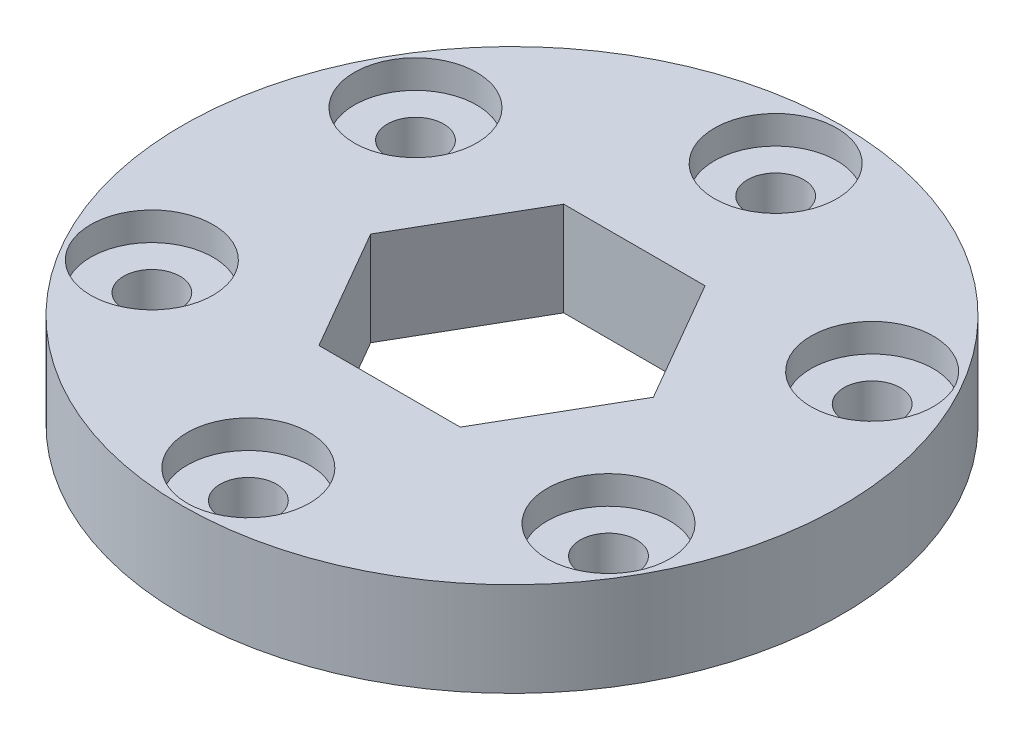
ISO-10303-21;
HEADER;
FILE_DESCRIPTION(('STEP AP214'),'2;1');
FILE_NAME('part.step','',(''),(''),'','','');
FILE_SCHEMA(('AUTOMOTIVE_DESIGN { 1 0 10303 214 1 1 1 1 }'));
ENDSEC;
DATA;
#1=APPLICATION_CONTEXT('core data for automotive mechanical design processes');
#2=APPLICATION_PROTOCOL_DEFINITION('international standard','automotive_design',2000,#1);
#3=PRODUCT_CONTEXT('',#1,'mechanical');
#4=PRODUCT('Part','Part','',(#3));
#5=PRODUCT_RELATED_PRODUCT_CATEGORY('part','',(#4));
#6=PRODUCT_DEFINITION_FORMATION('','',#4);
#7=PRODUCT_DEFINITION_CONTEXT('part definition',#1,'design');
#8=PRODUCT_DEFINITION('design','',#6,#7);
#9=PRODUCT_DEFINITION_SHAPE('','',#8);
#10=(LENGTH_UNIT() NAMED_UNIT(*) SI_UNIT(.MILLI.,.METRE.));
#11=(NAMED_UNIT(*) PLANE_ANGLE_UNIT() SI_UNIT($,.RADIAN.));
#12=(NAMED_UNIT(*) SI_UNIT($,.STERADIAN.) SOLID_ANGLE_UNIT());
#13=UNCERTAINTY_MEASURE_WITH_UNIT(LENGTH_MEASURE(1.E-05),#10,'distance_accuracy_value','');
#14=(GEOMETRIC_REPRESENTATION_CONTEXT(3) GLOBAL_UNCERTAINTY_ASSIGNED_CONTEXT((#13)) GLOBAL_UNIT_ASSIGNED_CONTEXT((#10,
#11,#12)) REPRESENTATION_CONTEXT('',''));
#15=CARTESIAN_POINT('',(0.,0.,0.));
#16=DIRECTION('',(0.,0.,1.));
#17=DIRECTION('',(1.,0.,0.));
#18=AXIS2_PLACEMENT_3D('',#15,#16,#17);
#19=CARTESIAN_POINT('',(0.,5.,-14.));
#20=DIRECTION('',(0.,-1.,0.));
#21=DIRECTION('',(0.,0.,-1.));
#22=AXIS2_PLACEMENT_3D('',#19,#20,#21);
#23=CYLINDRICAL_SURFACE('',#22,1.5);
#24=CARTESIAN_POINT('',(0.,0.,-14.));
#25=DIRECTION('',(0.,1.,0.));
#26=DIRECTION('',(0.,0.,1.));
#27=AXIS2_PLACEMENT_3D('',#24,#25,#26);
#28=CIRCLE('',#27,1.5);
#29=CARTESIAN_POINT('',(0.,0.,-12.5));
#30=VERTEX_POINT('',#29);
#31=EDGE_CURVE('E121',#30,#30,#28,.T.);
#32=ORIENTED_EDGE('',*,*,#31,.F.);
#33=EDGE_LOOP('',(#32));
#34=FACE_BOUND('',#33,.T.);
#35=CARTESIAN_POINT('',(0.,3.5,-14.));
#36=DIRECTION('',(0.,1.,0.));
#37=DIRECTION('',(0.,0.,1.));
#38=AXIS2_PLACEMENT_3D('',#35,#36,#37);
#39=CIRCLE('',#38,1.5);
#40=CARTESIAN_POINT('',(0.,3.5,-12.5));
#41=VERTEX_POINT('',#40);
#42=EDGE_CURVE('E37',#41,#41,#39,.T.);
#43=ORIENTED_EDGE('',*,*,#42,.T.);
#44=EDGE_LOOP('',(#43));
#45=FACE_BOUND('',#44,.T.);
#46=ADVANCED_FACE('F33',(#34,#45),#23,.F.);
#47=CARTESIAN_POINT('',(12.1243556529824,5.,-7.00000000000052));
#48=DIRECTION('',(0.,-1.,0.));
#49=DIRECTION('',(0.,0.,-1.));
#50=AXIS2_PLACEMENT_3D('',#47,#48,#49);
#51=CYLINDRICAL_SURFACE('',#50,1.50000000000017);
#52=CARTESIAN_POINT('',(12.1243556529824,0.,-7.00000000000052));
#53=DIRECTION('',(0.,1.,0.));
#54=DIRECTION('',(0.,0.,1.));
#55=AXIS2_PLACEMENT_3D('',#52,#53,#54);
#56=CIRCLE('',#55,1.50000000000017);
#57=CARTESIAN_POINT('',(12.1243556529824,0.,-5.50000000000035));
#58=VERTEX_POINT('',#57);
#59=EDGE_CURVE('E180',#58,#58,#56,.T.);
#60=ORIENTED_EDGE('',*,*,#59,.F.);
#61=EDGE_LOOP('',(#60));
#62=FACE_BOUND('',#61,.T.);
#63=CARTESIAN_POINT('',(12.1243556529824,3.5,-7.00000000000052));
#64=DIRECTION('',(0.,1.,0.));
#65=DIRECTION('',(0.,0.,1.));
#66=AXIS2_PLACEMENT_3D('',#63,#64,#65);
#67=CIRCLE('',#66,1.50000000000017);
#68=CARTESIAN_POINT('',(12.1243556529824,3.5,-5.50000000000035));
#69=VERTEX_POINT('',#68);
#70=EDGE_CURVE('E155',#69,#69,#67,.T.);
#71=ORIENTED_EDGE('',*,*,#70,.T.);
#72=EDGE_LOOP('',(#71));
#73=FACE_BOUND('',#72,.T.);
#74=ADVANCED_FACE('F189',(#62,#73),#51,.F.);
#75=CARTESIAN_POINT('',(12.124355652983,5.,6.99999999999948));
#76=DIRECTION('',(0.,-1.,0.));
#77=DIRECTION('',(0.,0.,-1.));
#78=AXIS2_PLACEMENT_3D('',#75,#76,#77);
#79=CYLINDRICAL_SURFACE('',#78,1.50000000000077);
#80=CARTESIAN_POINT('',(12.124355652983,0.,6.99999999999948));
#81=DIRECTION('',(0.,1.,0.));
#82=DIRECTION('',(0.,0.,1.));
#83=AXIS2_PLACEMENT_3D('',#80,#81,#82);
#84=CIRCLE('',#83,1.50000000000077);
#85=CARTESIAN_POINT('',(12.124355652983,0.,8.50000000000025));
#86=VERTEX_POINT('',#85);
#87=EDGE_CURVE('E177',#86,#86,#84,.T.);
#88=ORIENTED_EDGE('',*,*,#87,.F.);
#89=EDGE_LOOP('',(#88));
#90=FACE_BOUND('',#89,.T.);
#91=CARTESIAN_POINT('',(12.124355652983,3.5,6.99999999999948));
#92=DIRECTION('',(0.,1.,0.));
#93=DIRECTION('',(0.,0.,1.));
#94=AXIS2_PLACEMENT_3D('',#91,#92,#93);
#95=CIRCLE('',#94,1.50000000000077);
#96=CARTESIAN_POINT('',(12.124355652983,3.5,8.50000000000025));
#97=VERTEX_POINT('',#96);
#98=EDGE_CURVE('E153',#97,#97,#95,.T.);
#99=ORIENTED_EDGE('',*,*,#98,.T.);
#100=EDGE_LOOP('',(#99));
#101=FACE_BOUND('',#100,.T.);
#102=ADVANCED_FACE('F194',(#90,#101),#79,.F.);
#103=CARTESIAN_POINT('',(1.18856827952055E-12,5.,14.));
#104=DIRECTION('',(0.,-1.,0.));
#105=DIRECTION('',(0.,0.,-1.));
#106=AXIS2_PLACEMENT_3D('',#103,#104,#105);
#107=CYLINDRICAL_SURFACE('',#106,1.50000000000123);
#108=CARTESIAN_POINT('',(1.18856827952055E-12,0.,14.));
#109=DIRECTION('',(0.,1.,0.));
#110=DIRECTION('',(0.,0.,1.));
#111=AXIS2_PLACEMENT_3D('',#108,#109,#110);
#112=CIRCLE('',#111,1.50000000000123);
#113=CARTESIAN_POINT('',(1.18856827952055E-12,0.,15.5000000000012));
#114=VERTEX_POINT('',#113);
#115=EDGE_CURVE('E169',#114,#114,#112,.T.);
#116=ORIENTED_EDGE('',*,*,#115,.F.);
#117=EDGE_LOOP('',(#116));
#118=FACE_BOUND('',#117,.T.);
#119=CARTESIAN_POINT('',(1.18856827952055E-12,3.5,14.));
#120=DIRECTION('',(0.,1.,0.));
#121=DIRECTION('',(0.,0.,1.));
#122=AXIS2_PLACEMENT_3D('',#119,#120,#121);
#123=CIRCLE('',#122,1.50000000000123);
#124=CARTESIAN_POINT('',(1.18856827952055E-12,3.5,15.5000000000012));
#125=VERTEX_POINT('',#124);
#126=EDGE_CURVE('E150',#125,#125,#123,.T.);
#127=ORIENTED_EDGE('',*,*,#126,.T.);
#128=EDGE_LOOP('',(#127));
#129=FACE_BOUND('',#128,.T.);
#130=ADVANCED_FACE('F402',(#118,#129),#107,.F.);
#131=CARTESIAN_POINT('',(-12.1243556529812,5.,7.00000000000052));
#132=DIRECTION('',(0.,-1.,0.));
#133=DIRECTION('',(0.,0.,-1.));
#134=AXIS2_PLACEMENT_3D('',#131,#132,#133);
#135=CYLINDRICAL_SURFACE('',#134,1.50000000000113);
#136=CARTESIAN_POINT('',(-12.1243556529812,0.,7.00000000000052));
#137=DIRECTION('',(0.,1.,0.));
#138=DIRECTION('',(0.,0.,1.));
#139=AXIS2_PLACEMENT_3D('',#136,#137,#138);
#140=CIRCLE('',#139,1.50000000000113);
#141=CARTESIAN_POINT('',(-12.1243556529812,0.,8.50000000000166));
#142=VERTEX_POINT('',#141);
#143=EDGE_CURVE('E164',#142,#142,#140,.T.);
#144=ORIENTED_EDGE('',*,*,#143,.F.);
#145=EDGE_LOOP('',(#144));
#146=FACE_BOUND('',#145,.T.);
#147=CARTESIAN_POINT('',(-12.1243556529812,3.5,7.00000000000052));
#148=DIRECTION('',(0.,1.,0.));
#149=DIRECTION('',(0.,0.,1.));
#150=AXIS2_PLACEMENT_3D('',#147,#148,#149);
#151=CIRCLE('',#150,1.50000000000113);
#152=CARTESIAN_POINT('',(-12.1243556529812,3.5,8.50000000000166));
#153=VERTEX_POINT('',#152);
#154=EDGE_CURVE('E146',#153,#153,#151,.T.);
#155=ORIENTED_EDGE('',*,*,#154,.T.);
#156=EDGE_LOOP('',(#155));
#157=FACE_BOUND('',#156,.T.);
#158=ADVANCED_FACE('F410',(#146,#157),#135,.F.);
#159=CARTESIAN_POINT('',(-12.1243556529819,5.,-6.99999999999948));
#160=DIRECTION('',(0.,-1.,0.));
#161=DIRECTION('',(0.,0.,-1.));
#162=AXIS2_PLACEMENT_3D('',#159,#160,#161);
#163=CYLINDRICAL_SURFACE('',#162,1.5000000000006);
#164=CARTESIAN_POINT('',(-12.1243556529819,0.,-6.99999999999948));
#165=DIRECTION('',(0.,1.,0.));
#166=DIRECTION('',(0.,0.,1.));
#167=AXIS2_PLACEMENT_3D('',#164,#165,#166);
#168=CIRCLE('',#167,1.5000000000006);
#169=CARTESIAN_POINT('',(-12.1243556529819,0.,-5.49999999999888));
#170=VERTEX_POINT('',#169);
#171=EDGE_CURVE('E160',#170,#170,#168,.T.);
#172=ORIENTED_EDGE('',*,*,#171,.F.);
#173=EDGE_LOOP('',(#172));
#174=FACE_BOUND('',#173,.T.);
#175=CARTESIAN_POINT('',(-12.1243556529819,3.5,-6.99999999999948));
#176=DIRECTION('',(0.,1.,0.));
#177=DIRECTION('',(0.,0.,1.));
#178=AXIS2_PLACEMENT_3D('',#175,#176,#177);
#179=CIRCLE('',#178,1.5000000000006);
#180=CARTESIAN_POINT('',(-12.1243556529819,3.5,-5.49999999999888));
#181=VERTEX_POINT('',#180);
#182=EDGE_CURVE('E143',#181,#181,#179,.T.);
#183=ORIENTED_EDGE('',*,*,#182,.T.);
#184=EDGE_LOOP('',(#183));
#185=FACE_BOUND('',#184,.T.);
#186=ADVANCED_FACE('F220',(#174,#185),#163,.F.);
#187=CARTESIAN_POINT('',(0.,5.,0.));
#188=DIRECTION('',(0.,1.,0.));
#189=DIRECTION('',(0.,0.,1.));
#190=AXIS2_PLACEMENT_3D('',#187,#188,#189);
#191=PLANE('',#190);
#192=CARTESIAN_POINT('',(0.,5.,-14.0000000000005));
#193=DIRECTION('',(0.,1.,0.));
#194=DIRECTION('',(0.,0.,1.));
#195=AXIS2_PLACEMENT_3D('',#192,#193,#194);
#196=CIRCLE('',#195,3.25);
#197=CARTESIAN_POINT('',(0.,5.,-10.7500000000005));
#198=VERTEX_POINT('',#197);
#199=EDGE_CURVE('E470',#198,#198,#196,.T.);
#200=ORIENTED_EDGE('',*,*,#199,.F.);
#201=EDGE_LOOP('',(#200));
#202=FACE_BOUND('',#201,.T.);
#203=CARTESIAN_POINT('',(-12.1243556529823,5.,-6.99999999999973));
#204=DIRECTION('',(0.,1.,0.));
#205=DIRECTION('',(0.,0.,1.));
#206=AXIS2_PLACEMENT_3D('',#203,#204,#205);
#207=CIRCLE('',#206,3.2500000000006);
#208=CARTESIAN_POINT('',(-12.1243556529823,5.,-3.74999999999913));
#209=VERTEX_POINT('',#208);
#210=EDGE_CURVE('E463',#209,#209,#207,.T.);
#211=ORIENTED_EDGE('',*,*,#210,.F.);
#212=EDGE_LOOP('',(#211));
#213=FACE_BOUND('',#212,.T.);
#214=CARTESIAN_POINT('',(-12.1243556529817,5.,7.00000000000078));
#215=DIRECTION('',(0.,1.,0.));
#216=DIRECTION('',(0.,0.,1.));
#217=AXIS2_PLACEMENT_3D('',#214,#215,#216);
#218=CIRCLE('',#217,3.25000000000113);
#219=CARTESIAN_POINT('',(-12.1243556529817,5.,10.2500000000019));
#220=VERTEX_POINT('',#219);
#221=EDGE_CURVE('E172',#220,#220,#218,.T.);
#222=ORIENTED_EDGE('',*,*,#221,.F.);
#223=EDGE_LOOP('',(#222));
#224=FACE_BOUND('',#223,.T.);
#225=CARTESIAN_POINT('',(1.18856827952059E-12,5.,14.0000000000005));
#226=DIRECTION('',(0.,1.,0.));
#227=DIRECTION('',(0.,0.,1.));
#228=AXIS2_PLACEMENT_3D('',#225,#226,#227);
#229=CIRCLE('',#228,3.25000000000123);
#230=CARTESIAN_POINT('',(1.18856827952059E-12,5.,17.2500000000017));
#231=VERTEX_POINT('',#230);
#232=EDGE_CURVE('E488',#231,#231,#229,.T.);
#233=ORIENTED_EDGE('',*,*,#232,.F.);
#234=EDGE_LOOP('',(#233));
#235=FACE_BOUND('',#234,.T.);
#236=CARTESIAN_POINT('',(12.1243556529835,5.,6.99999999999974));
#237=DIRECTION('',(0.,1.,0.));
#238=DIRECTION('',(0.,0.,1.));
#239=AXIS2_PLACEMENT_3D('',#236,#237,#238);
#240=CIRCLE('',#239,3.25000000000077);
#241=CARTESIAN_POINT('',(12.1243556529835,5.,10.2500000000005));
#242=VERTEX_POINT('',#241);
#243=EDGE_CURVE('E482',#242,#242,#240,.T.);
#244=ORIENTED_EDGE('',*,*,#243,.F.);
#245=EDGE_LOOP('',(#244));
#246=FACE_BOUND('',#245,.T.);
#247=CARTESIAN_POINT('',(12.1243556529829,5.,-7.00000000000078));
#248=DIRECTION('',(0.,1.,0.));
#249=DIRECTION('',(0.,0.,1.));
#250=AXIS2_PLACEMENT_3D('',#247,#248,#249);
#251=CIRCLE('',#250,3.25000000000017);
#252=CARTESIAN_POINT('',(12.1243556529829,5.,-3.75000000000061));
#253=VERTEX_POINT('',#252);
#254=EDGE_CURVE('E476',#253,#253,#251,.T.);
#255=ORIENTED_EDGE('',*,*,#254,.F.);
#256=EDGE_LOOP('',(#255));
#257=FACE_BOUND('',#256,.T.);
#258=CARTESIAN_POINT('',(0.,5.,0.));
#259=DIRECTION('',(0.,1.,0.));
#260=DIRECTION('',(0.,0.,1.));
#261=AXIS2_PLACEMENT_3D('',#258,#259,#260);
#262=CIRCLE('',#261,17.5);
#263=CARTESIAN_POINT('',(0.,5.,17.5));
#264=VERTEX_POINT('',#263);
#265=EDGE_CURVE('E11',#264,#264,#262,.T.);
#266=ORIENTED_EDGE('',*,*,#265,.T.);
#267=EDGE_LOOP('',(#266));
#268=FACE_BOUND('',#267,.T.);
#269=DIRECTION('',(-0.5,0.,-0.866025403784439));
#270=VECTOR('',#269,1.);
#271=CARTESIAN_POINT('',(7.50555349946513,5.,0.));
#272=LINE('',#271,#270);
#273=CARTESIAN_POINT('',(7.50555349946513,5.,0.));
#274=VERTEX_POINT('',#273);
#275=CARTESIAN_POINT('',(3.75277674973256,5.,-6.5));
#276=VERTEX_POINT('',#275);
#277=EDGE_CURVE('E96',#274,#276,#272,.T.);
#278=ORIENTED_EDGE('',*,*,#277,.F.);
#279=DIRECTION('',(0.5,0.,-0.866025403784439));
#280=VECTOR('',#279,1.);
#281=CARTESIAN_POINT('',(3.75277674973257,5.,6.5));
#282=LINE('',#281,#280);
#283=CARTESIAN_POINT('',(3.75277674973257,5.,6.5));
#284=VERTEX_POINT('',#283);
#285=EDGE_CURVE('E88',#284,#274,#282,.T.);
#286=ORIENTED_EDGE('',*,*,#285,.F.);
#287=DIRECTION('',(1.,0.,0.));
#288=VECTOR('',#287,1.);
#289=CARTESIAN_POINT('',(-3.75277674973257,5.,6.5));
#290=LINE('',#289,#288);
#291=CARTESIAN_POINT('',(-3.75277674973257,5.,6.5));
#292=VERTEX_POINT('',#291);
#293=EDGE_CURVE('E118',#292,#284,#290,.T.);
#294=ORIENTED_EDGE('',*,*,#293,.F.);
#295=DIRECTION('',(0.5,0.,0.866025403784439));
#296=VECTOR('',#295,1.);
#297=CARTESIAN_POINT('',(-7.50555349946514,5.,0.));
#298=LINE('',#297,#296);
#299=CARTESIAN_POINT('',(-7.50555349946514,5.,0.));
#300=VERTEX_POINT('',#299);
#301=EDGE_CURVE('E116',#300,#292,#298,.T.);
#302=ORIENTED_EDGE('',*,*,#301,.F.);
#303=DIRECTION('',(-0.5,0.,0.866025403784439));
#304=VECTOR('',#303,1.);
#305=CARTESIAN_POINT('',(-3.75277674973257,5.,-6.5));
#306=LINE('',#305,#304);
#307=CARTESIAN_POINT('',(-3.75277674973257,5.,-6.5));
#308=VERTEX_POINT('',#307);
#309=EDGE_CURVE('E111',#308,#300,#306,.T.);
#310=ORIENTED_EDGE('',*,*,#309,.F.);
#311=DIRECTION('',(-1.,0.,0.));
#312=VECTOR('',#311,1.);
#313=CARTESIAN_POINT('',(3.75277674973256,5.,-6.5));
#314=LINE('',#313,#312);
#315=EDGE_CURVE('E109',#276,#308,#314,.T.);
#316=ORIENTED_EDGE('',*,*,#315,.F.);
#317=EDGE_LOOP('',(#278,#286,#294,#302,#310,#316));
#318=FACE_BOUND('',#317,.T.);
#319=ADVANCED_FACE('F107',(#202,#213,#224,#235,#246,#257,#268,#318),#191,.T.);
#320=CARTESIAN_POINT('',(0.,0.,0.));
#321=DIRECTION('',(0.,1.,0.));
#322=DIRECTION('',(0.,0.,1.));
#323=AXIS2_PLACEMENT_3D('',#320,#321,#322);
#324=PLANE('',#323);
#325=CARTESIAN_POINT('',(0.,0.,0.));
#326=DIRECTION('',(0.,1.,0.));
#327=DIRECTION('',(0.,0.,1.));
#328=AXIS2_PLACEMENT_3D('',#325,#326,#327);
#329=CIRCLE('',#328,17.5);
#330=CARTESIAN_POINT('',(0.,0.,17.5));
#331=VERTEX_POINT('',#330);
#332=EDGE_CURVE('E42',#331,#331,#329,.T.);
#333=ORIENTED_EDGE('',*,*,#332,.F.);
#334=EDGE_LOOP('',(#333));
#335=FACE_BOUND('',#334,.T.);
#336=DIRECTION('',(0.5,0.,-0.866025403784439));
#337=VECTOR('',#336,1.);
#338=CARTESIAN_POINT('',(3.75277674973257,0.,6.5));
#339=LINE('',#338,#337);
#340=CARTESIAN_POINT('',(3.75277674973257,0.,6.5));
#341=VERTEX_POINT('',#340);
#342=CARTESIAN_POINT('',(7.50555349946513,0.,0.));
#343=VERTEX_POINT('',#342);
#344=EDGE_CURVE('E58',#341,#343,#339,.T.);
#345=ORIENTED_EDGE('',*,*,#344,.T.);
#346=DIRECTION('',(-0.5,0.,-0.866025403784439));
#347=VECTOR('',#346,1.);
#348=CARTESIAN_POINT('',(7.50555349946513,0.,0.));
#349=LINE('',#348,#347);
#350=CARTESIAN_POINT('',(3.75277674973256,0.,-6.5));
#351=VERTEX_POINT('',#350);
#352=EDGE_CURVE('E103',#343,#351,#349,.T.);
#353=ORIENTED_EDGE('',*,*,#352,.T.);
#354=DIRECTION('',(-1.,0.,0.));
#355=VECTOR('',#354,1.);
#356=CARTESIAN_POINT('',(3.75277674973256,0.,-6.5));
#357=LINE('',#356,#355);
#358=CARTESIAN_POINT('',(-3.75277674973257,0.,-6.5));
#359=VERTEX_POINT('',#358);
#360=EDGE_CURVE('E123',#351,#359,#357,.T.);
#361=ORIENTED_EDGE('',*,*,#360,.T.);
#362=DIRECTION('',(-0.5,0.,0.866025403784439));
#363=VECTOR('',#362,1.);
#364=CARTESIAN_POINT('',(-3.75277674973257,0.,-6.5));
#365=LINE('',#364,#363);
#366=CARTESIAN_POINT('',(-7.50555349946514,0.,0.));
#367=VERTEX_POINT('',#366);
#368=EDGE_CURVE('E126',#359,#367,#365,.T.);
#369=ORIENTED_EDGE('',*,*,#368,.T.);
#370=DIRECTION('',(0.5,0.,0.866025403784439));
#371=VECTOR('',#370,1.);
#372=CARTESIAN_POINT('',(-7.50555349946514,0.,0.));
#373=LINE('',#372,#371);
#374=CARTESIAN_POINT('',(-3.75277674973257,0.,6.5));
#375=VERTEX_POINT('',#374);
#376=EDGE_CURVE('E129',#367,#375,#373,.T.);
#377=ORIENTED_EDGE('',*,*,#376,.T.);
#378=DIRECTION('',(1.,0.,0.));
#379=VECTOR('',#378,1.);
#380=CARTESIAN_POINT('',(-3.75277674973257,0.,6.5));
#381=LINE('',#380,#379);
#382=EDGE_CURVE('E97',#375,#341,#381,.T.);
#383=ORIENTED_EDGE('',*,*,#382,.T.);
#384=EDGE_LOOP('',(#345,#353,#361,#369,#377,#383));
#385=FACE_BOUND('',#384,.T.);
#386=ORIENTED_EDGE('',*,*,#31,.T.);
#387=EDGE_LOOP('',(#386));
#388=FACE_BOUND('',#387,.T.);
#389=ORIENTED_EDGE('',*,*,#59,.T.);
#390=EDGE_LOOP('',(#389));
#391=FACE_BOUND('',#390,.T.);
#392=ORIENTED_EDGE('',*,*,#87,.T.);
#393=EDGE_LOOP('',(#392));
#394=FACE_BOUND('',#393,.T.);
#395=ORIENTED_EDGE('',*,*,#115,.T.);
#396=EDGE_LOOP('',(#395));
#397=FACE_BOUND('',#396,.T.);
#398=ORIENTED_EDGE('',*,*,#143,.T.);
#399=EDGE_LOOP('',(#398));
#400=FACE_BOUND('',#399,.T.);
#401=ORIENTED_EDGE('',*,*,#171,.T.);
#402=EDGE_LOOP('',(#401));
#403=FACE_BOUND('',#402,.T.);
#404=ADVANCED_FACE('F185',(#335,#385,#388,#391,#394,#397,#400,#403),#324,.F.);
#405=CARTESIAN_POINT('',(0.,5.,0.));
#406=DIRECTION('',(0.,-1.,0.));
#407=DIRECTION('',(0.,0.,-1.));
#408=AXIS2_PLACEMENT_3D('',#405,#406,#407);
#409=CYLINDRICAL_SURFACE('',#408,17.5);
#410=ORIENTED_EDGE('',*,*,#265,.F.);
#411=EDGE_LOOP('',(#410));
#412=FACE_BOUND('',#411,.T.);
#413=ORIENTED_EDGE('',*,*,#332,.T.);
#414=EDGE_LOOP('',(#413));
#415=FACE_BOUND('',#414,.T.);
#416=ADVANCED_FACE('F35',(#412,#415),#409,.T.);
#417=CARTESIAN_POINT('',(3.75277674973257,5.,6.5));
#418=DIRECTION('',(-0.866025403784439,0.,-0.5));
#419=DIRECTION('',(-0.5,0.,0.866025403784439));
#420=AXIS2_PLACEMENT_3D('',#417,#418,#419);
#421=PLANE('',#420);
#422=ORIENTED_EDGE('',*,*,#344,.F.);
#423=DIRECTION('',(0.,-1.,0.));
#424=VECTOR('',#423,1.);
#425=CARTESIAN_POINT('',(3.75277674973257,5.,6.5));
#426=LINE('',#425,#424);
#427=EDGE_CURVE('E92',#284,#341,#426,.T.);
#428=ORIENTED_EDGE('',*,*,#427,.F.);
#429=ORIENTED_EDGE('',*,*,#285,.T.);
#430=DIRECTION('',(0.,-1.,0.));
#431=VECTOR('',#430,1.);
#432=CARTESIAN_POINT('',(7.50555349946513,5.,0.));
#433=LINE('',#432,#431);
#434=EDGE_CURVE('E91',#274,#343,#433,.T.);
#435=ORIENTED_EDGE('',*,*,#434,.T.);
#436=EDGE_LOOP('',(#422,#428,#429,#435));
#437=FACE_BOUND('',#436,.T.);
#438=ADVANCED_FACE('F90',(#437),#421,.T.);
#439=CARTESIAN_POINT('',(7.50555349946513,5.,0.));
#440=DIRECTION('',(-0.866025403784438,0.,0.5));
#441=DIRECTION('',(0.5,0.,0.866025403784439));
#442=AXIS2_PLACEMENT_3D('',#439,#440,#441);
#443=PLANE('',#442);
#444=ORIENTED_EDGE('',*,*,#352,.F.);
#445=ORIENTED_EDGE('',*,*,#434,.F.);
#446=ORIENTED_EDGE('',*,*,#277,.T.);
#447=DIRECTION('',(0.,-1.,0.));
#448=VECTOR('',#447,1.);
#449=CARTESIAN_POINT('',(3.75277674973256,5.,-6.5));
#450=LINE('',#449,#448);
#451=EDGE_CURVE('E104',#276,#351,#450,.T.);
#452=ORIENTED_EDGE('',*,*,#451,.T.);
#453=EDGE_LOOP('',(#444,#445,#446,#452));
#454=FACE_BOUND('',#453,.T.);
#455=ADVANCED_FACE('F100',(#454),#443,.T.);
#456=CARTESIAN_POINT('',(3.75277674973256,5.,-6.5));
#457=DIRECTION('',(0.,0.,1.));
#458=DIRECTION('',(1.,0.,0.));
#459=AXIS2_PLACEMENT_3D('',#456,#457,#458);
#460=PLANE('',#459);
#461=ORIENTED_EDGE('',*,*,#360,.F.);
#462=ORIENTED_EDGE('',*,*,#451,.F.);
#463=ORIENTED_EDGE('',*,*,#315,.T.);
#464=DIRECTION('',(0.,-1.,0.));
#465=VECTOR('',#464,1.);
#466=CARTESIAN_POINT('',(-3.75277674973257,5.,-6.5));
#467=LINE('',#466,#465);
#468=EDGE_CURVE('E138',#308,#359,#467,.T.);
#469=ORIENTED_EDGE('',*,*,#468,.T.);
#470=EDGE_LOOP('',(#461,#462,#463,#469));
#471=FACE_BOUND('',#470,.T.);
#472=ADVANCED_FACE('F210',(#471),#460,.T.);
#473=CARTESIAN_POINT('',(-3.75277674973257,5.,-6.5));
#474=DIRECTION('',(0.866025403784439,0.,0.5));
#475=DIRECTION('',(0.5,0.,-0.866025403784439));
#476=AXIS2_PLACEMENT_3D('',#473,#474,#475);
#477=PLANE('',#476);
#478=ORIENTED_EDGE('',*,*,#368,.F.);
#479=ORIENTED_EDGE('',*,*,#468,.F.);
#480=ORIENTED_EDGE('',*,*,#309,.T.);
#481=DIRECTION('',(0.,-1.,0.));
#482=VECTOR('',#481,1.);
#483=CARTESIAN_POINT('',(-7.50555349946514,5.,0.));
#484=LINE('',#483,#482);
#485=EDGE_CURVE('E136',#300,#367,#484,.T.);
#486=ORIENTED_EDGE('',*,*,#485,.T.);
#487=EDGE_LOOP('',(#478,#479,#480,#486));
#488=FACE_BOUND('',#487,.T.);
#489=ADVANCED_FACE('F206',(#488),#477,.T.);
#490=CARTESIAN_POINT('',(-7.50555349946514,5.,0.));
#491=DIRECTION('',(0.866025403784439,0.,-0.5));
#492=DIRECTION('',(-0.5,0.,-0.866025403784439));
#493=AXIS2_PLACEMENT_3D('',#490,#491,#492);
#494=PLANE('',#493);
#495=ORIENTED_EDGE('',*,*,#376,.F.);
#496=ORIENTED_EDGE('',*,*,#485,.F.);
#497=ORIENTED_EDGE('',*,*,#301,.T.);
#498=DIRECTION('',(0.,-1.,0.));
#499=VECTOR('',#498,1.);
#500=CARTESIAN_POINT('',(-3.75277674973257,5.,6.5));
#501=LINE('',#500,#499);
#502=EDGE_CURVE('E50',#292,#375,#501,.T.);
#503=ORIENTED_EDGE('',*,*,#502,.T.);
#504=EDGE_LOOP('',(#495,#496,#497,#503));
#505=FACE_BOUND('',#504,.T.);
#506=ADVANCED_FACE('F203',(#505),#494,.T.);
#507=CARTESIAN_POINT('',(-3.75277674973257,5.,6.5));
#508=DIRECTION('',(0.,0.,-1.));
#509=DIRECTION('',(-1.,0.,0.));
#510=AXIS2_PLACEMENT_3D('',#507,#508,#509);
#511=PLANE('',#510);
#512=ORIENTED_EDGE('',*,*,#382,.F.);
#513=ORIENTED_EDGE('',*,*,#502,.F.);
#514=ORIENTED_EDGE('',*,*,#293,.T.);
#515=ORIENTED_EDGE('',*,*,#427,.T.);
#516=EDGE_LOOP('',(#512,#513,#514,#515));
#517=FACE_BOUND('',#516,.T.);
#518=ADVANCED_FACE('F199',(#517),#511,.T.);
#519=CARTESIAN_POINT('',(-12.1243556529823,3.5,-6.99999999999973));
#520=DIRECTION('',(0.,1.,0.));
#521=DIRECTION('',(0.,0.,1.));
#522=AXIS2_PLACEMENT_3D('',#519,#520,#521);
#523=CYLINDRICAL_SURFACE('',#522,3.2500000000006);
#524=CARTESIAN_POINT('',(-12.1243556529823,3.5,-6.99999999999973));
#525=DIRECTION('',(0.,1.,0.));
#526=DIRECTION('',(0.,0.,1.));
#527=AXIS2_PLACEMENT_3D('',#524,#525,#526);
#528=CIRCLE('',#527,3.2500000000006);
#529=CARTESIAN_POINT('',(-12.1243556529823,3.5,-3.74999999999913));
#530=VERTEX_POINT('',#529);
#531=EDGE_CURVE('E462',#530,#530,#528,.T.);
#532=ORIENTED_EDGE('',*,*,#531,.F.);
#533=EDGE_LOOP('',(#532));
#534=FACE_BOUND('',#533,.T.);
#535=ORIENTED_EDGE('',*,*,#210,.T.);
#536=EDGE_LOOP('',(#535));
#537=FACE_BOUND('',#536,.T.);
#538=ADVANCED_FACE('F202',(#534,#537),#523,.F.);
#539=CARTESIAN_POINT('',(-12.1243556529823,3.5,-6.99999999999973));
#540=DIRECTION('',(0.,1.,0.));
#541=DIRECTION('',(0.,0.,1.));
#542=AXIS2_PLACEMENT_3D('',#539,#540,#541);
#543=PLANE('',#542);
#544=ORIENTED_EDGE('',*,*,#182,.F.);
#545=EDGE_LOOP('',(#544));
#546=FACE_BOUND('',#545,.T.);
#547=ORIENTED_EDGE('',*,*,#531,.T.);
#548=EDGE_LOOP('',(#547));
#549=FACE_BOUND('',#548,.T.);
#550=ADVANCED_FACE('F271',(#546,#549),#543,.T.);
#551=CARTESIAN_POINT('',(-12.1243556529817,3.5,7.00000000000078));
#552=DIRECTION('',(0.,1.,0.));
#553=DIRECTION('',(0.,0.,1.));
#554=AXIS2_PLACEMENT_3D('',#551,#552,#553);
#555=CYLINDRICAL_SURFACE('',#554,3.25000000000113);
#556=CARTESIAN_POINT('',(-12.1243556529817,3.5,7.00000000000078));
#557=DIRECTION('',(0.,1.,0.));
#558=DIRECTION('',(0.,0.,1.));
#559=AXIS2_PLACEMENT_3D('',#556,#557,#558);
#560=CIRCLE('',#559,3.25000000000113);
#561=CARTESIAN_POINT('',(-12.1243556529817,3.5,10.2500000000019));
#562=VERTEX_POINT('',#561);
#563=EDGE_CURVE('E466',#562,#562,#560,.T.);
#564=ORIENTED_EDGE('',*,*,#563,.F.);
#565=EDGE_LOOP('',(#564));
#566=FACE_BOUND('',#565,.T.);
#567=ORIENTED_EDGE('',*,*,#221,.T.);
#568=EDGE_LOOP('',(#567));
#569=FACE_BOUND('',#568,.T.);
#570=ADVANCED_FACE('F280',(#566,#569),#555,.F.);
#571=CARTESIAN_POINT('',(-12.1243556529817,3.5,7.00000000000078));
#572=DIRECTION('',(0.,1.,0.));
#573=DIRECTION('',(0.,0.,1.));
#574=AXIS2_PLACEMENT_3D('',#571,#572,#573);
#575=PLANE('',#574);
#576=ORIENTED_EDGE('',*,*,#154,.F.);
#577=EDGE_LOOP('',(#576));
#578=FACE_BOUND('',#577,.T.);
#579=ORIENTED_EDGE('',*,*,#563,.T.);
#580=EDGE_LOOP('',(#579));
#581=FACE_BOUND('',#580,.T.);
#582=ADVANCED_FACE('F288',(#578,#581),#575,.T.);
#583=CARTESIAN_POINT('',(1.18856827952059E-12,3.5,14.0000000000005));
#584=DIRECTION('',(0.,1.,0.));
#585=DIRECTION('',(0.,0.,1.));
#586=AXIS2_PLACEMENT_3D('',#583,#584,#585);
#587=CYLINDRICAL_SURFACE('',#586,3.25000000000123);
#588=CARTESIAN_POINT('',(1.18856827952059E-12,3.5,14.0000000000005));
#589=DIRECTION('',(0.,1.,0.));
#590=DIRECTION('',(0.,0.,1.));
#591=AXIS2_PLACEMENT_3D('',#588,#589,#590);
#592=CIRCLE('',#591,3.25000000000123);
#593=CARTESIAN_POINT('',(1.18856827952059E-12,3.5,17.2500000000017));
#594=VERTEX_POINT('',#593);
#595=EDGE_CURVE('E485',#594,#594,#592,.T.);
#596=ORIENTED_EDGE('',*,*,#595,.F.);
#597=EDGE_LOOP('',(#596));
#598=FACE_BOUND('',#597,.T.);
#599=ORIENTED_EDGE('',*,*,#232,.T.);
#600=EDGE_LOOP('',(#599));
#601=FACE_BOUND('',#600,.T.);
#602=ADVANCED_FACE('F296',(#598,#601),#587,.F.);
#603=CARTESIAN_POINT('',(1.18856827952059E-12,3.5,14.0000000000005));
#604=DIRECTION('',(0.,1.,0.));
#605=DIRECTION('',(0.,0.,1.));
#606=AXIS2_PLACEMENT_3D('',#603,#604,#605);
#607=PLANE('',#606);
#608=ORIENTED_EDGE('',*,*,#126,.F.);
#609=EDGE_LOOP('',(#608));
#610=FACE_BOUND('',#609,.T.);
#611=ORIENTED_EDGE('',*,*,#595,.T.);
#612=EDGE_LOOP('',(#611));
#613=FACE_BOUND('',#612,.T.);
#614=ADVANCED_FACE('F304',(#610,#613),#607,.T.);
#615=CARTESIAN_POINT('',(12.1243556529835,3.5,6.99999999999974));
#616=DIRECTION('',(0.,1.,0.));
#617=DIRECTION('',(0.,0.,1.));
#618=AXIS2_PLACEMENT_3D('',#615,#616,#617);
#619=CYLINDRICAL_SURFACE('',#618,3.25000000000077);
#620=CARTESIAN_POINT('',(12.1243556529835,3.5,6.99999999999974));
#621=DIRECTION('',(0.,1.,0.));
#622=DIRECTION('',(0.,0.,1.));
#623=AXIS2_PLACEMENT_3D('',#620,#621,#622);
#624=CIRCLE('',#623,3.25000000000077);
#625=CARTESIAN_POINT('',(12.1243556529835,3.5,10.2500000000005));
#626=VERTEX_POINT('',#625);
#627=EDGE_CURVE('E479',#626,#626,#624,.T.);
#628=ORIENTED_EDGE('',*,*,#627,.F.);
#629=EDGE_LOOP('',(#628));
#630=FACE_BOUND('',#629,.T.);
#631=ORIENTED_EDGE('',*,*,#243,.T.);
#632=EDGE_LOOP('',(#631));
#633=FACE_BOUND('',#632,.T.);
#634=ADVANCED_FACE('F312',(#630,#633),#619,.F.);
#635=CARTESIAN_POINT('',(12.1243556529835,3.5,6.99999999999974));
#636=DIRECTION('',(0.,1.,0.));
#637=DIRECTION('',(0.,0.,1.));
#638=AXIS2_PLACEMENT_3D('',#635,#636,#637);
#639=PLANE('',#638);
#640=ORIENTED_EDGE('',*,*,#98,.F.);
#641=EDGE_LOOP('',(#640));
#642=FACE_BOUND('',#641,.T.);
#643=ORIENTED_EDGE('',*,*,#627,.T.);
#644=EDGE_LOOP('',(#643));
#645=FACE_BOUND('',#644,.T.);
#646=ADVANCED_FACE('F320',(#642,#645),#639,.T.);
#647=CARTESIAN_POINT('',(12.1243556529829,3.5,-7.00000000000078));
#648=DIRECTION('',(0.,1.,0.));
#649=DIRECTION('',(0.,0.,1.));
#650=AXIS2_PLACEMENT_3D('',#647,#648,#649);
#651=CYLINDRICAL_SURFACE('',#650,3.25000000000017);
#652=CARTESIAN_POINT('',(12.1243556529829,3.5,-7.00000000000078));
#653=DIRECTION('',(0.,1.,0.));
#654=DIRECTION('',(0.,0.,1.));
#655=AXIS2_PLACEMENT_3D('',#652,#653,#654);
#656=CIRCLE('',#655,3.25000000000017);
#657=CARTESIAN_POINT('',(12.1243556529829,3.5,-3.75000000000061));
#658=VERTEX_POINT('',#657);
#659=EDGE_CURVE('E473',#658,#658,#656,.T.);
#660=ORIENTED_EDGE('',*,*,#659,.F.);
#661=EDGE_LOOP('',(#660));
#662=FACE_BOUND('',#661,.T.);
#663=ORIENTED_EDGE('',*,*,#254,.T.);
#664=EDGE_LOOP('',(#663));
#665=FACE_BOUND('',#664,.T.);
#666=ADVANCED_FACE('F328',(#662,#665),#651,.F.);
#667=CARTESIAN_POINT('',(12.1243556529829,3.5,-7.00000000000078));
#668=DIRECTION('',(0.,1.,0.));
#669=DIRECTION('',(0.,0.,1.));
#670=AXIS2_PLACEMENT_3D('',#667,#668,#669);
#671=PLANE('',#670);
#672=ORIENTED_EDGE('',*,*,#70,.F.);
#673=EDGE_LOOP('',(#672));
#674=FACE_BOUND('',#673,.T.);
#675=ORIENTED_EDGE('',*,*,#659,.T.);
#676=EDGE_LOOP('',(#675));
#677=FACE_BOUND('',#676,.T.);
#678=ADVANCED_FACE('F336',(#674,#677),#671,.T.);
#679=CARTESIAN_POINT('',(0.,3.5,-14.0000000000005));
#680=DIRECTION('',(0.,1.,0.));
#681=DIRECTION('',(0.,0.,1.));
#682=AXIS2_PLACEMENT_3D('',#679,#680,#681);
#683=CYLINDRICAL_SURFACE('',#682,3.25);
#684=CARTESIAN_POINT('',(0.,3.5,-14.0000000000005));
#685=DIRECTION('',(0.,1.,0.));
#686=DIRECTION('',(0.,0.,1.));
#687=AXIS2_PLACEMENT_3D('',#684,#685,#686);
#688=CIRCLE('',#687,3.25);
#689=CARTESIAN_POINT('',(0.,3.5,-10.7500000000005));
#690=VERTEX_POINT('',#689);
#691=EDGE_CURVE('E147',#690,#690,#688,.T.);
#692=ORIENTED_EDGE('',*,*,#691,.F.);
#693=EDGE_LOOP('',(#692));
#694=FACE_BOUND('',#693,.T.);
#695=ORIENTED_EDGE('',*,*,#199,.T.);
#696=EDGE_LOOP('',(#695));
#697=FACE_BOUND('',#696,.T.);
#698=ADVANCED_FACE('F344',(#694,#697),#683,.F.);
#699=CARTESIAN_POINT('',(0.,3.5,-14.0000000000005));
#700=DIRECTION('',(0.,1.,0.));
#701=DIRECTION('',(0.,0.,1.));
#702=AXIS2_PLACEMENT_3D('',#699,#700,#701);
#703=PLANE('',#702);
#704=ORIENTED_EDGE('',*,*,#42,.F.);
#705=EDGE_LOOP('',(#704));
#706=FACE_BOUND('',#705,.T.);
#707=ORIENTED_EDGE('',*,*,#691,.T.);
#708=EDGE_LOOP('',(#707));
#709=FACE_BOUND('',#708,.T.);
#710=ADVANCED_FACE('F352',(#706,#709),#703,.T.);
#711=CLOSED_SHELL('',(#46,#74,#102,#130,#158,#186,#319,#404,#416,#438,#455,#472,#489,#506,#518,
#538,#550,#570,#582,#602,#614,#634,#646,#666,#678,#698,#710));
#712=MANIFOLD_SOLID_BREP('B2',#711);
#713=ADVANCED_BREP_SHAPE_REPRESENTATION('',(#18,#712),#14);
#714=SHAPE_DEFINITION_REPRESENTATION(#9,#713);
ENDSEC;
END-ISO-10303-21;
